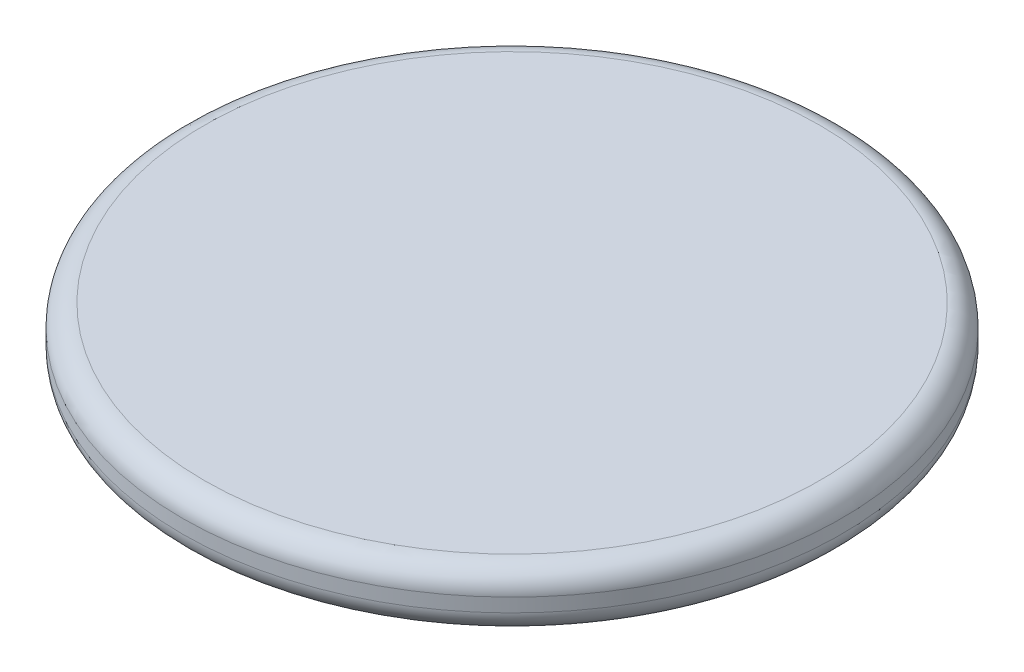
ISO-10303-21;
HEADER;
FILE_DESCRIPTION(('STEP AP214'),'2;1');
FILE_NAME('part.step','',(''),(''),'','','');
FILE_SCHEMA(('AUTOMOTIVE_DESIGN { 1 0 10303 214 1 1 1 1 }'));
ENDSEC;
DATA;
#1=APPLICATION_CONTEXT('core data for automotive mechanical design processes');
#2=APPLICATION_PROTOCOL_DEFINITION('international standard','automotive_design',2000,#1);
#3=PRODUCT_CONTEXT('',#1,'mechanical');
#4=PRODUCT('Part','Part','',(#3));
#5=PRODUCT_RELATED_PRODUCT_CATEGORY('part','',(#4));
#6=PRODUCT_DEFINITION_FORMATION('','',#4);
#7=PRODUCT_DEFINITION_CONTEXT('part definition',#1,'design');
#8=PRODUCT_DEFINITION('design','',#6,#7);
#9=PRODUCT_DEFINITION_SHAPE('','',#8);
#10=(LENGTH_UNIT() NAMED_UNIT(*) SI_UNIT(.MILLI.,.METRE.));
#11=(NAMED_UNIT(*) PLANE_ANGLE_UNIT() SI_UNIT($,.RADIAN.));
#12=(NAMED_UNIT(*) SI_UNIT($,.STERADIAN.) SOLID_ANGLE_UNIT());
#13=UNCERTAINTY_MEASURE_WITH_UNIT(LENGTH_MEASURE(1.E-05),#10,'distance_accuracy_value','');
#14=(GEOMETRIC_REPRESENTATION_CONTEXT(3) GLOBAL_UNCERTAINTY_ASSIGNED_CONTEXT((#13)) GLOBAL_UNIT_ASSIGNED_CONTEXT((#10,
#11,#12)) REPRESENTATION_CONTEXT('',''));
#15=CARTESIAN_POINT('',(0.,0.,0.));
#16=DIRECTION('',(0.,0.,1.));
#17=DIRECTION('',(1.,0.,0.));
#18=AXIS2_PLACEMENT_3D('',#15,#16,#17);
#19=CARTESIAN_POINT('',(-132.587246663371,20.,-38.4369088811995));
#20=DIRECTION('',(0.,-1.,0.));
#21=DIRECTION('',(0.,0.,-1.));
#22=AXIS2_PLACEMENT_3D('',#19,#20,#21);
#23=CYLINDRICAL_SURFACE('',#22,115.);
#24=CARTESIAN_POINT('',(-132.587246663371,7.62,-38.4369088811995));
#25=DIRECTION('',(0.,1.,0.));
#26=DIRECTION('',(0.,0.,1.));
#27=AXIS2_PLACEMENT_3D('',#24,#25,#26);
#28=CIRCLE('',#27,115.);
#29=CARTESIAN_POINT('',(-132.587246663371,7.62,76.5630911188005));
#30=VERTEX_POINT('',#29);
#31=EDGE_CURVE('E42',#30,#30,#28,.T.);
#32=ORIENTED_EDGE('',*,*,#31,.T.);
#33=EDGE_LOOP('',(#32));
#34=FACE_BOUND('',#33,.T.);
#35=CARTESIAN_POINT('',(-132.587246663371,12.38,-38.4369088811995));
#36=DIRECTION('',(0.,1.,0.));
#37=DIRECTION('',(0.,0.,1.));
#38=AXIS2_PLACEMENT_3D('',#35,#36,#37);
#39=CIRCLE('',#38,115.);
#40=CARTESIAN_POINT('',(-132.587246663371,12.38,76.5630911188005));
#41=VERTEX_POINT('',#40);
#42=EDGE_CURVE('E46',#41,#41,#39,.F.);
#43=ORIENTED_EDGE('',*,*,#42,.T.);
#44=EDGE_LOOP('',(#43));
#45=FACE_BOUND('',#44,.T.);
#46=ADVANCED_FACE('F31',(#34,#45),#23,.T.);
#47=CARTESIAN_POINT('',(-132.587246663371,20.,-38.4369088811995));
#48=DIRECTION('',(0.,1.,0.));
#49=DIRECTION('',(0.,0.,1.));
#50=AXIS2_PLACEMENT_3D('',#47,#48,#49);
#51=PLANE('',#50);
#52=CARTESIAN_POINT('',(-132.587246663371,20.,-38.4369088811995));
#53=DIRECTION('',(0.,1.,0.));
#54=DIRECTION('',(0.,0.,1.));
#55=AXIS2_PLACEMENT_3D('',#52,#53,#54);
#56=CIRCLE('',#55,107.38);
#57=CARTESIAN_POINT('',(-132.587246663371,20.,68.9430911188005));
#58=VERTEX_POINT('',#57);
#59=EDGE_CURVE('E10',#58,#58,#56,.T.);
#60=ORIENTED_EDGE('',*,*,#59,.T.);
#61=EDGE_LOOP('',(#60));
#62=FACE_BOUND('',#61,.T.);
#63=ADVANCED_FACE('F68',(#62),#51,.T.);
#64=CARTESIAN_POINT('',(-132.587246663371,0.,-38.4369088811995));
#65=DIRECTION('',(0.,1.,0.));
#66=DIRECTION('',(0.,0.,1.));
#67=AXIS2_PLACEMENT_3D('',#64,#65,#66);
#68=PLANE('',#67);
#69=CARTESIAN_POINT('',(-132.587246663371,0.,-38.4369088811995));
#70=DIRECTION('',(0.,1.,0.));
#71=DIRECTION('',(0.,0.,1.));
#72=AXIS2_PLACEMENT_3D('',#69,#70,#71);
#73=CIRCLE('',#72,107.38);
#74=CARTESIAN_POINT('',(-132.587246663371,0.,68.9430911188005));
#75=VERTEX_POINT('',#74);
#76=EDGE_CURVE('E38',#75,#75,#73,.F.);
#77=ORIENTED_EDGE('',*,*,#76,.T.);
#78=EDGE_LOOP('',(#77));
#79=FACE_BOUND('',#78,.T.);
#80=CARTESIAN_POINT('',(-131.263903023724,0.,-37.444401151464));
#81=DIRECTION('',(0.,-1.,0.));
#82=DIRECTION('',(0.,0.,-1.));
#83=AXIS2_PLACEMENT_3D('',#80,#81,#82);
#84=CIRCLE('',#83,30.);
#85=CARTESIAN_POINT('',(-131.263903023724,0.,-67.444401151464));
#86=VERTEX_POINT('',#85);
#87=EDGE_CURVE('E51',#86,#86,#84,.T.);
#88=ORIENTED_EDGE('',*,*,#87,.F.);
#89=EDGE_LOOP('',(#88));
#90=FACE_BOUND('',#89,.T.);
#91=ADVANCED_FACE('F63',(#79,#90),#68,.F.);
#92=CARTESIAN_POINT('',(-131.263903023724,-50.,-37.444401151464));
#93=DIRECTION('',(0.,1.,0.));
#94=DIRECTION('',(0.,0.,1.));
#95=AXIS2_PLACEMENT_3D('',#92,#93,#94);
#96=CYLINDRICAL_SURFACE('',#95,30.);
#97=CARTESIAN_POINT('',(-131.263903023724,-50.,-37.444401151464));
#98=DIRECTION('',(0.,-1.,0.));
#99=DIRECTION('',(0.,0.,-1.));
#100=AXIS2_PLACEMENT_3D('',#97,#98,#99);
#101=CIRCLE('',#100,30.);
#102=CARTESIAN_POINT('',(-131.263903023724,-50.,-67.444401151464));
#103=VERTEX_POINT('',#102);
#104=EDGE_CURVE('E54',#103,#103,#101,.T.);
#105=ORIENTED_EDGE('',*,*,#104,.F.);
#106=EDGE_LOOP('',(#105));
#107=FACE_BOUND('',#106,.T.);
#108=ORIENTED_EDGE('',*,*,#87,.T.);
#109=EDGE_LOOP('',(#108));
#110=FACE_BOUND('',#109,.T.);
#111=ADVANCED_FACE('F60',(#107,#110),#96,.T.);
#112=CARTESIAN_POINT('',(-131.263903023724,-50.,-37.444401151464));
#113=DIRECTION('',(0.,-1.,0.));
#114=DIRECTION('',(0.,0.,-1.));
#115=AXIS2_PLACEMENT_3D('',#112,#113,#114);
#116=PLANE('',#115);
#117=ORIENTED_EDGE('',*,*,#104,.T.);
#118=EDGE_LOOP('',(#117));
#119=FACE_BOUND('',#118,.T.);
#120=ADVANCED_FACE('F58',(#119),#116,.T.);
#121=CARTESIAN_POINT('',(-132.587246663371,7.62,-38.4369088811995));
#122=DIRECTION('',(0.,1.,0.));
#123=DIRECTION('',(0.,0.,1.));
#124=AXIS2_PLACEMENT_3D('',#121,#122,#123);
#125=TOROIDAL_SURFACE('',#124,107.38,7.62);
#126=ORIENTED_EDGE('',*,*,#76,.F.);
#127=EDGE_LOOP('',(#126));
#128=FACE_BOUND('',#127,.T.);
#129=ORIENTED_EDGE('',*,*,#31,.F.);
#130=EDGE_LOOP('',(#129));
#131=FACE_BOUND('',#130,.T.);
#132=ADVANCED_FACE('F80',(#128,#131),#125,.T.);
#133=CARTESIAN_POINT('',(-132.587246663371,12.38,-38.4369088811995));
#134=DIRECTION('',(0.,1.,0.));
#135=DIRECTION('',(0.,0.,1.));
#136=AXIS2_PLACEMENT_3D('',#133,#134,#135);
#137=TOROIDAL_SURFACE('',#136,107.38,7.62);
#138=ORIENTED_EDGE('',*,*,#42,.F.);
#139=EDGE_LOOP('',(#138));
#140=FACE_BOUND('',#139,.T.);
#141=ORIENTED_EDGE('',*,*,#59,.F.);
#142=EDGE_LOOP('',(#141));
#143=FACE_BOUND('',#142,.T.);
#144=ADVANCED_FACE('F33',(#140,#143),#137,.T.);
#145=CLOSED_SHELL('',(#46,#63,#91,#111,#120,#132,#144));
#146=MANIFOLD_SOLID_BREP('B2',#145);
#147=ADVANCED_BREP_SHAPE_REPRESENTATION('',(#18,#146),#14);
#148=SHAPE_DEFINITION_REPRESENTATION(#9,#147);
ENDSEC;
END-ISO-10303-21;
